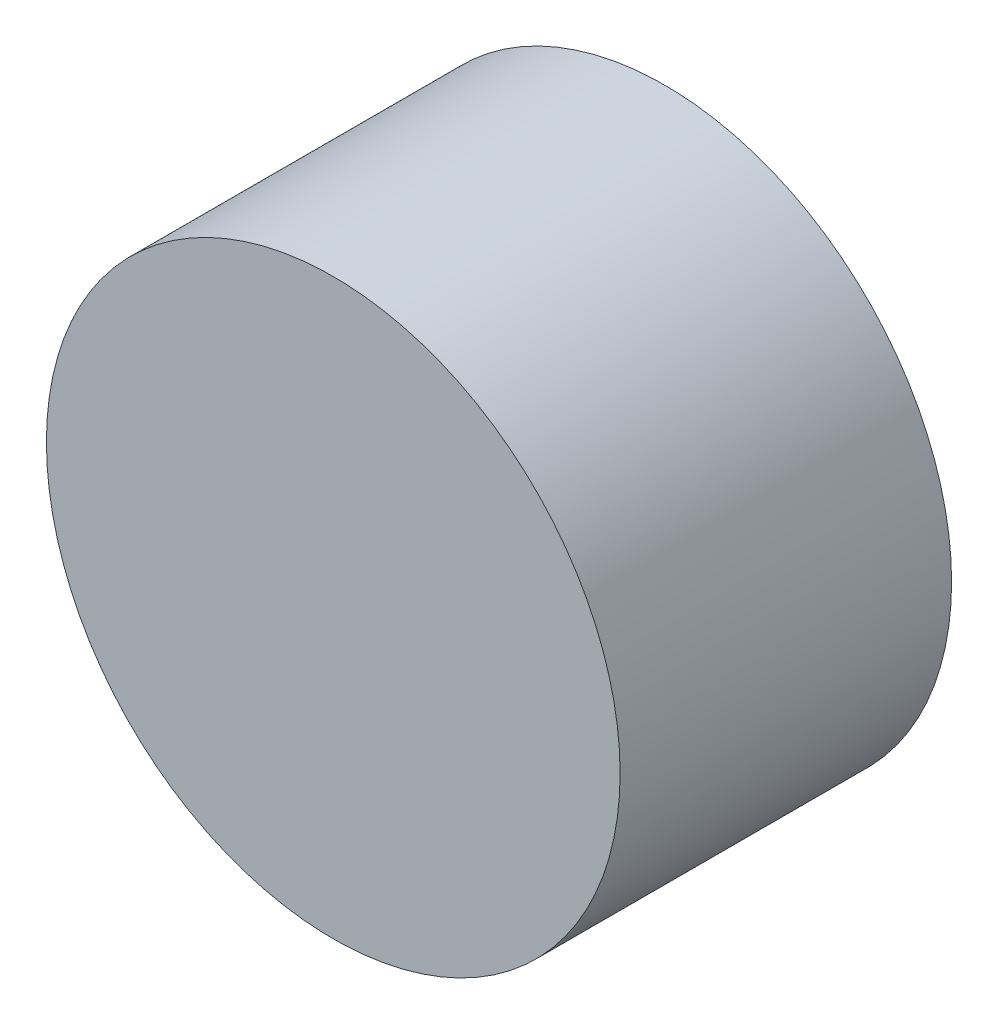
ISO-10303-21;
HEADER;
FILE_DESCRIPTION(('STEP AP214'),'2;1');
FILE_NAME('part.step','',(''),(''),'','','');
FILE_SCHEMA(('AUTOMOTIVE_DESIGN { 1 0 10303 214 1 1 1 1 }'));
ENDSEC;
DATA;
#1=APPLICATION_CONTEXT('core data for automotive mechanical design processes');
#2=APPLICATION_PROTOCOL_DEFINITION('international standard','automotive_design',2000,#1);
#3=PRODUCT_CONTEXT('',#1,'mechanical');
#4=PRODUCT('Part','Part','',(#3));
#5=PRODUCT_RELATED_PRODUCT_CATEGORY('part','',(#4));
#6=PRODUCT_DEFINITION_FORMATION('','',#4);
#7=PRODUCT_DEFINITION_CONTEXT('part definition',#1,'design');
#8=PRODUCT_DEFINITION('design','',#6,#7);
#9=PRODUCT_DEFINITION_SHAPE('','',#8);
#10=(LENGTH_UNIT() NAMED_UNIT(*) SI_UNIT(.MILLI.,.METRE.));
#11=(NAMED_UNIT(*) PLANE_ANGLE_UNIT() SI_UNIT($,.RADIAN.));
#12=(NAMED_UNIT(*) SI_UNIT($,.STERADIAN.) SOLID_ANGLE_UNIT());
#13=UNCERTAINTY_MEASURE_WITH_UNIT(LENGTH_MEASURE(1.E-05),#10,'distance_accuracy_value','');
#14=(GEOMETRIC_REPRESENTATION_CONTEXT(3) GLOBAL_UNCERTAINTY_ASSIGNED_CONTEXT((#13)) GLOBAL_UNIT_ASSIGNED_CONTEXT((#10,
#11,#12)) REPRESENTATION_CONTEXT('',''));
#15=CARTESIAN_POINT('',(0.,0.,0.));
#16=DIRECTION('',(0.,0.,1.));
#17=DIRECTION('',(1.,0.,0.));
#18=AXIS2_PLACEMENT_3D('',#15,#16,#17);
#19=CARTESIAN_POINT('',(0.,0.,260.));
#20=DIRECTION('',(0.,0.,-1.));
#21=DIRECTION('',(-1.,0.,0.));
#22=AXIS2_PLACEMENT_3D('',#19,#20,#21);
#23=CYLINDRICAL_SURFACE('',#22,225.);
#24=CARTESIAN_POINT('',(0.,0.,260.));
#25=DIRECTION('',(0.,0.,1.));
#26=DIRECTION('',(1.,0.,0.));
#27=AXIS2_PLACEMENT_3D('',#24,#25,#26);
#28=CIRCLE('',#27,225.);
#29=CARTESIAN_POINT('',(225.,0.,260.));
#30=VERTEX_POINT('',#29);
#31=EDGE_CURVE('E10',#30,#30,#28,.T.);
#32=ORIENTED_EDGE('',*,*,#31,.F.);
#33=EDGE_LOOP('',(#32));
#34=FACE_BOUND('',#33,.T.);
#35=CARTESIAN_POINT('',(0.,0.,0.));
#36=DIRECTION('',(0.,0.,1.));
#37=DIRECTION('',(1.,0.,0.));
#38=AXIS2_PLACEMENT_3D('',#35,#36,#37);
#39=CIRCLE('',#38,225.);
#40=CARTESIAN_POINT('',(225.,0.,0.));
#41=VERTEX_POINT('',#40);
#42=EDGE_CURVE('E46',#41,#41,#39,.T.);
#43=ORIENTED_EDGE('',*,*,#42,.T.);
#44=EDGE_LOOP('',(#43));
#45=FACE_BOUND('',#44,.T.);
#46=ADVANCED_FACE('F43',(#34,#45),#23,.T.);
#47=CARTESIAN_POINT('',(0.,0.,260.));
#48=DIRECTION('',(0.,0.,1.));
#49=DIRECTION('',(1.,0.,0.));
#50=AXIS2_PLACEMENT_3D('',#47,#48,#49);
#51=PLANE('',#50);
#52=ORIENTED_EDGE('',*,*,#31,.T.);
#53=EDGE_LOOP('',(#52));
#54=FACE_BOUND('',#53,.T.);
#55=ADVANCED_FACE('F60',(#54),#51,.T.);
#56=CARTESIAN_POINT('',(0.,0.,0.));
#57=DIRECTION('',(0.,0.,1.));
#58=DIRECTION('',(1.,0.,0.));
#59=AXIS2_PLACEMENT_3D('',#56,#57,#58);
#60=PLANE('',#59);
#61=ORIENTED_EDGE('',*,*,#42,.F.);
#62=EDGE_LOOP('',(#61));
#63=FACE_BOUND('',#62,.T.);
#64=ADVANCED_FACE('F58',(#63),#60,.F.);
#65=CLOSED_SHELL('',(#46,#55,#64));
#66=MANIFOLD_SOLID_BREP('B2',#65);
#67=ADVANCED_BREP_SHAPE_REPRESENTATION('',(#18,#66),#14);
#68=SHAPE_DEFINITION_REPRESENTATION(#9,#67);
ENDSEC;
END-ISO-10303-21;
